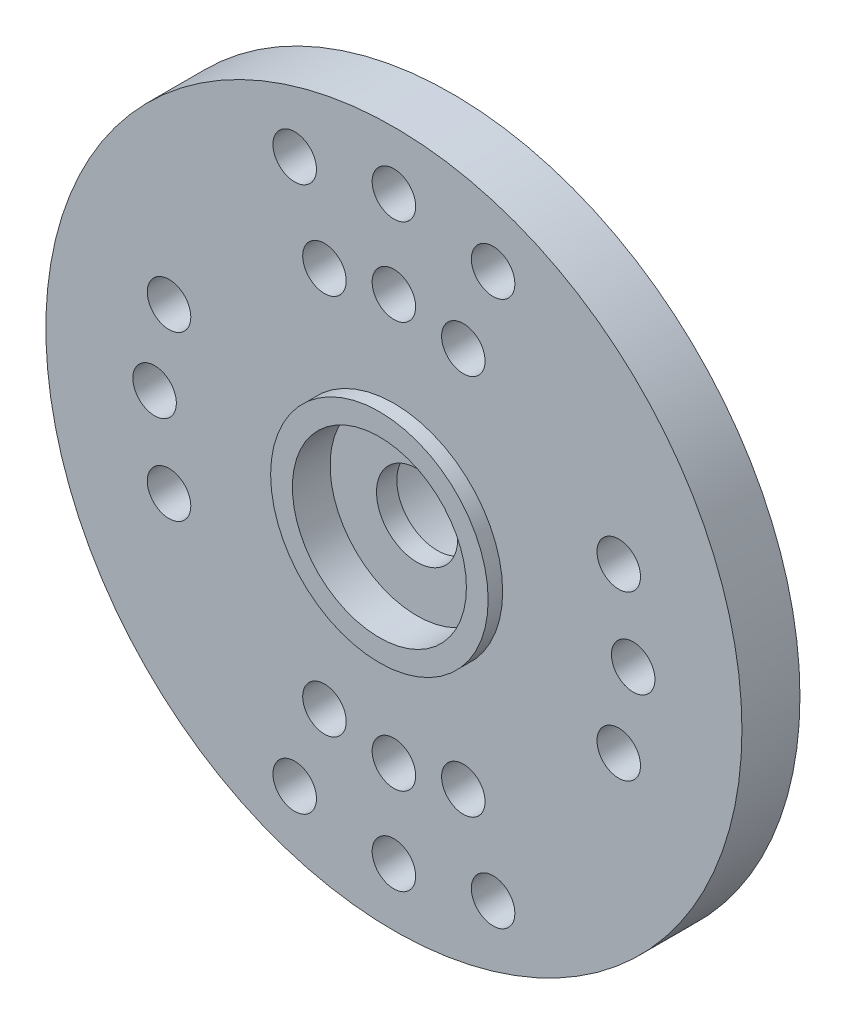
ISO-10303-21;
HEADER;
FILE_DESCRIPTION(('STEP AP214'),'2;1');
FILE_NAME('part.step','',(''),(''),'','','');
FILE_SCHEMA(('AUTOMOTIVE_DESIGN { 1 0 10303 214 1 1 1 1 }'));
ENDSEC;
DATA;
#1=APPLICATION_CONTEXT('core data for automotive mechanical design processes');
#2=APPLICATION_PROTOCOL_DEFINITION('international standard','automotive_design',2000,#1);
#3=PRODUCT_CONTEXT('',#1,'mechanical');
#4=PRODUCT('Part','Part','',(#3));
#5=PRODUCT_RELATED_PRODUCT_CATEGORY('part','',(#4));
#6=PRODUCT_DEFINITION_FORMATION('','',#4);
#7=PRODUCT_DEFINITION_CONTEXT('part definition',#1,'design');
#8=PRODUCT_DEFINITION('design','',#6,#7);
#9=PRODUCT_DEFINITION_SHAPE('','',#8);
#10=(LENGTH_UNIT() NAMED_UNIT(*) SI_UNIT(.MILLI.,.METRE.));
#11=(NAMED_UNIT(*) PLANE_ANGLE_UNIT() SI_UNIT($,.RADIAN.));
#12=(NAMED_UNIT(*) SI_UNIT($,.STERADIAN.) SOLID_ANGLE_UNIT());
#13=UNCERTAINTY_MEASURE_WITH_UNIT(LENGTH_MEASURE(1.E-05),#10,'distance_accuracy_value','');
#14=(GEOMETRIC_REPRESENTATION_CONTEXT(3) GLOBAL_UNCERTAINTY_ASSIGNED_CONTEXT((#13)) GLOBAL_UNIT_ASSIGNED_CONTEXT((#10,
#11,#12)) REPRESENTATION_CONTEXT('',''));
#15=CARTESIAN_POINT('',(0.,0.,0.));
#16=DIRECTION('',(0.,0.,1.));
#17=DIRECTION('',(1.,0.,0.));
#18=AXIS2_PLACEMENT_3D('',#15,#16,#17);
#19=CARTESIAN_POINT('',(0.,3.,-1.5));
#20=DIRECTION('',(0.,0.,-1.));
#21=DIRECTION('',(-1.,0.,0.));
#22=AXIS2_PLACEMENT_3D('',#19,#20,#21);
#23=PLANE('',#22);
#24=CARTESIAN_POINT('',(0.,0.,-1.5));
#25=DIRECTION('',(0.,0.,1.));
#26=DIRECTION('',(1.,0.,0.));
#27=AXIS2_PLACEMENT_3D('',#24,#25,#26);
#28=CIRCLE('',#27,3.);
#29=CARTESIAN_POINT('',(3.,0.,-1.5));
#30=VERTEX_POINT('',#29);
#31=EDGE_CURVE('E17',#30,#30,#28,.F.);
#32=ORIENTED_EDGE('',*,*,#31,.T.);
#33=EDGE_LOOP('',(#32));
#34=FACE_BOUND('',#33,.T.);
#35=CARTESIAN_POINT('',(0.,0.,-1.5));
#36=DIRECTION('',(0.,0.,1.));
#37=DIRECTION('',(1.,0.,0.));
#38=AXIS2_PLACEMENT_3D('',#35,#36,#37);
#39=CIRCLE('',#38,1.4);
#40=CARTESIAN_POINT('',(1.4,0.,-1.5));
#41=VERTEX_POINT('',#40);
#42=EDGE_CURVE('E159',#41,#41,#39,.T.);
#43=ORIENTED_EDGE('',*,*,#42,.T.);
#44=EDGE_LOOP('',(#43));
#45=FACE_BOUND('',#44,.T.);
#46=ADVANCED_FACE('F14',(#34,#45),#23,.T.);
#47=CARTESIAN_POINT('',(0.,0.,50.));
#48=DIRECTION('',(0.,0.,1.));
#49=DIRECTION('',(1.,0.,0.));
#50=AXIS2_PLACEMENT_3D('',#47,#48,#49);
#51=CYLINDRICAL_SURFACE('',#50,3.);
#52=ORIENTED_EDGE('',*,*,#31,.F.);
#53=EDGE_LOOP('',(#52));
#54=FACE_BOUND('',#53,.T.);
#55=CARTESIAN_POINT('',(0.,0.,-4.5));
#56=DIRECTION('',(0.,0.,1.));
#57=DIRECTION('',(1.,0.,0.));
#58=AXIS2_PLACEMENT_3D('',#55,#56,#57);
#59=CIRCLE('',#58,3.);
#60=CARTESIAN_POINT('',(3.,0.,-4.5));
#61=VERTEX_POINT('',#60);
#62=EDGE_CURVE('E157',#61,#61,#59,.T.);
#63=ORIENTED_EDGE('',*,*,#62,.F.);
#64=EDGE_LOOP('',(#63));
#65=FACE_BOUND('',#64,.T.);
#66=ADVANCED_FACE('F167',(#54,#65),#51,.F.);
#67=CARTESIAN_POINT('',(0.,0.,50.));
#68=DIRECTION('',(0.,0.,1.));
#69=DIRECTION('',(1.,0.,0.));
#70=AXIS2_PLACEMENT_3D('',#67,#68,#69);
#71=CYLINDRICAL_SURFACE('',#70,1.4);
#72=ORIENTED_EDGE('',*,*,#42,.F.);
#73=EDGE_LOOP('',(#72));
#74=FACE_BOUND('',#73,.T.);
#75=CARTESIAN_POINT('',(0.,0.,-0.800000000000002));
#76=DIRECTION('',(0.,0.,1.));
#77=DIRECTION('',(1.,0.,0.));
#78=AXIS2_PLACEMENT_3D('',#75,#76,#77);
#79=CIRCLE('',#78,1.4);
#80=CARTESIAN_POINT('',(1.4,0.,-0.800000000000002));
#81=VERTEX_POINT('',#80);
#82=EDGE_CURVE('E154',#81,#81,#79,.T.);
#83=ORIENTED_EDGE('',*,*,#82,.T.);
#84=EDGE_LOOP('',(#83));
#85=FACE_BOUND('',#84,.T.);
#86=ADVANCED_FACE('F170',(#74,#85),#71,.F.);
#87=CARTESIAN_POINT('',(0.,4.5,-4.5));
#88=DIRECTION('',(0.,0.,-1.));
#89=DIRECTION('',(-1.,0.,0.));
#90=AXIS2_PLACEMENT_3D('',#87,#88,#89);
#91=PLANE('',#90);
#92=CARTESIAN_POINT('',(0.,0.,-4.5));
#93=DIRECTION('',(0.,0.,1.));
#94=DIRECTION('',(1.,0.,0.));
#95=AXIS2_PLACEMENT_3D('',#92,#93,#94);
#96=CIRCLE('',#95,4.5);
#97=CARTESIAN_POINT('',(4.5,0.,-4.5));
#98=VERTEX_POINT('',#97);
#99=EDGE_CURVE('E151',#98,#98,#96,.T.);
#100=ORIENTED_EDGE('',*,*,#99,.F.);
#101=EDGE_LOOP('',(#100));
#102=FACE_BOUND('',#101,.T.);
#103=ORIENTED_EDGE('',*,*,#62,.T.);
#104=EDGE_LOOP('',(#103));
#105=FACE_BOUND('',#104,.T.);
#106=ADVANCED_FACE('F173',(#102,#105),#91,.T.);
#107=CARTESIAN_POINT('',(0.,3.,-0.8));
#108=DIRECTION('',(0.,0.,-1.));
#109=DIRECTION('',(-1.,0.,0.));
#110=AXIS2_PLACEMENT_3D('',#107,#108,#109);
#111=PLANE('',#110);
#112=CARTESIAN_POINT('',(0.,0.,-0.800000000000002));
#113=DIRECTION('',(0.,0.,1.));
#114=DIRECTION('',(1.,0.,0.));
#115=AXIS2_PLACEMENT_3D('',#112,#113,#114);
#116=CIRCLE('',#115,3.);
#117=CARTESIAN_POINT('',(3.,0.,-0.800000000000002));
#118=VERTEX_POINT('',#117);
#119=EDGE_CURVE('E148',#118,#118,#116,.T.);
#120=ORIENTED_EDGE('',*,*,#119,.T.);
#121=EDGE_LOOP('',(#120));
#122=FACE_BOUND('',#121,.T.);
#123=ORIENTED_EDGE('',*,*,#82,.F.);
#124=EDGE_LOOP('',(#123));
#125=FACE_BOUND('',#124,.T.);
#126=ADVANCED_FACE('F175',(#122,#125),#111,.F.);
#127=CARTESIAN_POINT('',(0.,0.,50.));
#128=DIRECTION('',(0.,0.,1.));
#129=DIRECTION('',(1.,0.,0.));
#130=AXIS2_PLACEMENT_3D('',#127,#128,#129);
#131=CYLINDRICAL_SURFACE('',#130,4.5);
#132=ORIENTED_EDGE('',*,*,#99,.T.);
#133=EDGE_LOOP('',(#132));
#134=FACE_BOUND('',#133,.T.);
#135=CARTESIAN_POINT('',(0.,0.,-2.));
#136=DIRECTION('',(0.,0.,1.));
#137=DIRECTION('',(1.,0.,0.));
#138=AXIS2_PLACEMENT_3D('',#135,#136,#137);
#139=CIRCLE('',#138,4.5);
#140=CARTESIAN_POINT('',(4.5,0.,-2.));
#141=VERTEX_POINT('',#140);
#142=EDGE_CURVE('E145',#141,#141,#139,.T.);
#143=ORIENTED_EDGE('',*,*,#142,.F.);
#144=EDGE_LOOP('',(#143));
#145=FACE_BOUND('',#144,.T.);
#146=ADVANCED_FACE('F183',(#134,#145),#131,.T.);
#147=CARTESIAN_POINT('',(0.,0.,50.));
#148=DIRECTION('',(0.,0.,1.));
#149=DIRECTION('',(1.,0.,0.));
#150=AXIS2_PLACEMENT_3D('',#147,#148,#149);
#151=CYLINDRICAL_SURFACE('',#150,3.);
#152=ORIENTED_EDGE('',*,*,#119,.F.);
#153=EDGE_LOOP('',(#152));
#154=FACE_BOUND('',#153,.T.);
#155=CARTESIAN_POINT('',(0.,0.,0.5));
#156=DIRECTION('',(0.,0.,1.));
#157=DIRECTION('',(1.,0.,0.));
#158=AXIS2_PLACEMENT_3D('',#155,#156,#157);
#159=CIRCLE('',#158,3.);
#160=CARTESIAN_POINT('',(3.,0.,0.5));
#161=VERTEX_POINT('',#160);
#162=EDGE_CURVE('E142',#161,#161,#159,.T.);
#163=ORIENTED_EDGE('',*,*,#162,.T.);
#164=EDGE_LOOP('',(#163));
#165=FACE_BOUND('',#164,.T.);
#166=ADVANCED_FACE('F284',(#154,#165),#151,.F.);
#167=CARTESIAN_POINT('',(0.,12.,-2.));
#168=DIRECTION('',(0.,0.,-1.));
#169=DIRECTION('',(-1.,0.,0.));
#170=AXIS2_PLACEMENT_3D('',#167,#168,#169);
#171=PLANE('',#170);
#172=CARTESIAN_POINT('',(0.,0.,-2.));
#173=DIRECTION('',(0.,0.,1.));
#174=DIRECTION('',(1.,0.,0.));
#175=AXIS2_PLACEMENT_3D('',#172,#173,#174);
#176=CIRCLE('',#175,12.);
#177=CARTESIAN_POINT('',(12.,0.,-2.));
#178=VERTEX_POINT('',#177);
#179=EDGE_CURVE('E85',#178,#178,#176,.T.);
#180=ORIENTED_EDGE('',*,*,#179,.F.);
#181=EDGE_LOOP('',(#180));
#182=FACE_BOUND('',#181,.T.);
#183=ORIENTED_EDGE('',*,*,#142,.T.);
#184=EDGE_LOOP('',(#183));
#185=FACE_BOUND('',#184,.T.);
#186=CARTESIAN_POINT('',(8.25,0.,-2.));
#187=DIRECTION('',(0.,0.,1.));
#188=DIRECTION('',(1.,0.,0.));
#189=AXIS2_PLACEMENT_3D('',#186,#187,#188);
#190=CIRCLE('',#189,0.750000000000001);
#191=CARTESIAN_POINT('',(9.,0.,-2.));
#192=VERTEX_POINT('',#191);
#193=EDGE_CURVE('E88',#192,#192,#190,.T.);
#194=ORIENTED_EDGE('',*,*,#193,.T.);
#195=EDGE_LOOP('',(#194));
#196=FACE_BOUND('',#195,.T.);
#197=CARTESIAN_POINT('',(7.75246412148374,-2.82166618243677,-2.));
#198=DIRECTION('',(0.,0.,1.));
#199=DIRECTION('',(1.,0.,0.));
#200=AXIS2_PLACEMENT_3D('',#197,#198,#199);
#201=CIRCLE('',#200,0.750000000000001);
#202=CARTESIAN_POINT('',(8.50246412148374,-2.82166618243677,-2.));
#203=VERTEX_POINT('',#202);
#204=EDGE_CURVE('E91',#203,#203,#201,.T.);
#205=ORIENTED_EDGE('',*,*,#204,.T.);
#206=EDGE_LOOP('',(#205));
#207=FACE_BOUND('',#206,.T.);
#208=CARTESIAN_POINT('',(0.,7.,-2.));
#209=DIRECTION('',(0.,0.,1.));
#210=DIRECTION('',(1.,0.,0.));
#211=AXIS2_PLACEMENT_3D('',#208,#209,#210);
#212=CIRCLE('',#211,0.75);
#213=CARTESIAN_POINT('',(0.75,7.,-2.));
#214=VERTEX_POINT('',#213);
#215=EDGE_CURVE('E94',#214,#214,#212,.T.);
#216=ORIENTED_EDGE('',*,*,#215,.T.);
#217=EDGE_LOOP('',(#216));
#218=FACE_BOUND('',#217,.T.);
#219=CARTESIAN_POINT('',(7.75246412148374,2.82166618243677,-2.));
#220=DIRECTION('',(0.,0.,1.));
#221=DIRECTION('',(1.,0.,0.));
#222=AXIS2_PLACEMENT_3D('',#219,#220,#221);
#223=CIRCLE('',#222,0.750000000000001);
#224=CARTESIAN_POINT('',(8.50246412148374,2.82166618243677,-2.));
#225=VERTEX_POINT('',#224);
#226=EDGE_CURVE('E97',#225,#225,#223,.T.);
#227=ORIENTED_EDGE('',*,*,#226,.T.);
#228=EDGE_LOOP('',(#227));
#229=FACE_BOUND('',#228,.T.);
#230=CARTESIAN_POINT('',(-8.25,0.,-2.));
#231=DIRECTION('',(0.,0.,1.));
#232=DIRECTION('',(1.,0.,0.));
#233=AXIS2_PLACEMENT_3D('',#230,#231,#232);
#234=CIRCLE('',#233,0.750000000000001);
#235=CARTESIAN_POINT('',(-7.5,0.,-2.));
#236=VERTEX_POINT('',#235);
#237=EDGE_CURVE('E100',#236,#236,#234,.T.);
#238=ORIENTED_EDGE('',*,*,#237,.T.);
#239=EDGE_LOOP('',(#238));
#240=FACE_BOUND('',#239,.T.);
#241=CARTESIAN_POINT('',(-7.75246412148372,2.82166618243683,-2.));
#242=DIRECTION('',(0.,0.,1.));
#243=DIRECTION('',(1.,0.,0.));
#244=AXIS2_PLACEMENT_3D('',#241,#242,#243);
#245=CIRCLE('',#244,0.75);
#246=CARTESIAN_POINT('',(-7.00246412148372,2.82166618243683,-2.));
#247=VERTEX_POINT('',#246);
#248=EDGE_CURVE('E103',#247,#247,#245,.T.);
#249=ORIENTED_EDGE('',*,*,#248,.T.);
#250=EDGE_LOOP('',(#249));
#251=FACE_BOUND('',#250,.T.);
#252=CARTESIAN_POINT('',(-7.75246412148376,-2.82166618243672,-2.));
#253=DIRECTION('',(0.,0.,1.));
#254=DIRECTION('',(1.,0.,0.));
#255=AXIS2_PLACEMENT_3D('',#252,#253,#254);
#256=CIRCLE('',#255,0.75);
#257=CARTESIAN_POINT('',(-7.00246412148376,-2.82166618243672,-2.));
#258=VERTEX_POINT('',#257);
#259=EDGE_CURVE('E106',#258,#258,#256,.T.);
#260=ORIENTED_EDGE('',*,*,#259,.T.);
#261=EDGE_LOOP('',(#260));
#262=FACE_BOUND('',#261,.T.);
#263=CARTESIAN_POINT('',(0.,10.,-2.));
#264=DIRECTION('',(0.,0.,1.));
#265=DIRECTION('',(1.,0.,0.));
#266=AXIS2_PLACEMENT_3D('',#263,#264,#265);
#267=CIRCLE('',#266,0.75);
#268=CARTESIAN_POINT('',(0.75,10.,-2.));
#269=VERTEX_POINT('',#268);
#270=EDGE_CURVE('E109',#269,#269,#267,.T.);
#271=ORIENTED_EDGE('',*,*,#270,.T.);
#272=EDGE_LOOP('',(#271));
#273=FACE_BOUND('',#272,.T.);
#274=CARTESIAN_POINT('',(2.39414100327969,6.57784834550136,-2.));
#275=DIRECTION('',(0.,0.,1.));
#276=DIRECTION('',(1.,0.,0.));
#277=AXIS2_PLACEMENT_3D('',#274,#275,#276);
#278=CIRCLE('',#277,0.75);
#279=CARTESIAN_POINT('',(3.14414100327969,6.57784834550136,-2.));
#280=VERTEX_POINT('',#279);
#281=EDGE_CURVE('E112',#280,#280,#278,.T.);
#282=ORIENTED_EDGE('',*,*,#281,.T.);
#283=EDGE_LOOP('',(#282));
#284=FACE_BOUND('',#283,.T.);
#285=CARTESIAN_POINT('',(3.4202014332567,9.39692620785908,-2.));
#286=DIRECTION('',(0.,0.,1.));
#287=DIRECTION('',(1.,0.,0.));
#288=AXIS2_PLACEMENT_3D('',#285,#286,#287);
#289=CIRCLE('',#288,0.75);
#290=CARTESIAN_POINT('',(4.1702014332567,9.39692620785908,-2.));
#291=VERTEX_POINT('',#290);
#292=EDGE_CURVE('E115',#291,#291,#289,.T.);
#293=ORIENTED_EDGE('',*,*,#292,.T.);
#294=EDGE_LOOP('',(#293));
#295=FACE_BOUND('',#294,.T.);
#296=CARTESIAN_POINT('',(-2.39414100327969,6.57784834550136,-2.));
#297=DIRECTION('',(0.,0.,1.));
#298=DIRECTION('',(1.,0.,0.));
#299=AXIS2_PLACEMENT_3D('',#296,#297,#298);
#300=CIRCLE('',#299,0.749999999999999);
#301=CARTESIAN_POINT('',(-1.64414100327969,6.57784834550136,-2.));
#302=VERTEX_POINT('',#301);
#303=EDGE_CURVE('E118',#302,#302,#300,.T.);
#304=ORIENTED_EDGE('',*,*,#303,.T.);
#305=EDGE_LOOP('',(#304));
#306=FACE_BOUND('',#305,.T.);
#307=CARTESIAN_POINT('',(-3.4202014332567,9.39692620785908,-2.));
#308=DIRECTION('',(0.,0.,1.));
#309=DIRECTION('',(1.,0.,0.));
#310=AXIS2_PLACEMENT_3D('',#307,#308,#309);
#311=CIRCLE('',#310,0.750000000000001);
#312=CARTESIAN_POINT('',(-2.67020143325669,9.39692620785908,-2.));
#313=VERTEX_POINT('',#312);
#314=EDGE_CURVE('E121',#313,#313,#311,.T.);
#315=ORIENTED_EDGE('',*,*,#314,.T.);
#316=EDGE_LOOP('',(#315));
#317=FACE_BOUND('',#316,.T.);
#318=CARTESIAN_POINT('',(0.,-7.00000000000041,-2.));
#319=DIRECTION('',(0.,0.,1.));
#320=DIRECTION('',(1.,0.,0.));
#321=AXIS2_PLACEMENT_3D('',#318,#319,#320);
#322=CIRCLE('',#321,0.749999999999878);
#323=CARTESIAN_POINT('',(0.749999999999827,-7.00000000000041,-2.));
#324=VERTEX_POINT('',#323);
#325=EDGE_CURVE('E124',#324,#324,#322,.T.);
#326=ORIENTED_EDGE('',*,*,#325,.T.);
#327=EDGE_LOOP('',(#326));
#328=FACE_BOUND('',#327,.T.);
#329=CARTESIAN_POINT('',(-1.06391624818261E-12,-10.0000000000004,-2.));
#330=DIRECTION('',(0.,0.,1.));
#331=DIRECTION('',(1.,0.,0.));
#332=AXIS2_PLACEMENT_3D('',#329,#330,#331);
#333=CIRCLE('',#332,0.74999999999893);
#334=CARTESIAN_POINT('',(0.749999999997866,-10.0000000000004,-2.));
#335=VERTEX_POINT('',#334);
#336=EDGE_CURVE('E127',#335,#335,#333,.T.);
#337=ORIENTED_EDGE('',*,*,#336,.T.);
#338=EDGE_LOOP('',(#337));
#339=FACE_BOUND('',#338,.T.);
#340=CARTESIAN_POINT('',(-2.39414100327964,-6.57784834550095,-2.));
#341=DIRECTION('',(0.,0.,1.));
#342=DIRECTION('',(1.,0.,0.));
#343=AXIS2_PLACEMENT_3D('',#340,#341,#342);
#344=CIRCLE('',#343,0.750000000000075);
#345=CARTESIAN_POINT('',(-1.64414100327956,-6.57784834550095,-2.));
#346=VERTEX_POINT('',#345);
#347=EDGE_CURVE('E130',#346,#346,#344,.T.);
#348=ORIENTED_EDGE('',*,*,#347,.T.);
#349=EDGE_LOOP('',(#348));
#350=FACE_BOUND('',#349,.T.);
#351=CARTESIAN_POINT('',(-3.42020143325761,-9.39692620785832,-2.));
#352=DIRECTION('',(0.,0.,1.));
#353=DIRECTION('',(1.,0.,0.));
#354=AXIS2_PLACEMENT_3D('',#351,#352,#353);
#355=CIRCLE('',#354,0.749999999999109);
#356=CARTESIAN_POINT('',(-2.6702014332585,-9.39692620785832,-2.));
#357=VERTEX_POINT('',#356);
#358=EDGE_CURVE('E133',#357,#357,#355,.T.);
#359=ORIENTED_EDGE('',*,*,#358,.T.);
#360=EDGE_LOOP('',(#359));
#361=FACE_BOUND('',#360,.T.);
#362=CARTESIAN_POINT('',(2.39414100327971,-6.5778483455026,-2.));
#363=DIRECTION('',(0.,0.,1.));
#364=DIRECTION('',(1.,0.,0.));
#365=AXIS2_PLACEMENT_3D('',#362,#363,#364);
#366=CIRCLE('',#365,0.749999999999315);
#367=CARTESIAN_POINT('',(3.14414100327902,-6.5778483455026,-2.));
#368=VERTEX_POINT('',#367);
#369=EDGE_CURVE('E136',#368,#368,#366,.T.);
#370=ORIENTED_EDGE('',*,*,#369,.T.);
#371=EDGE_LOOP('',(#370));
#372=FACE_BOUND('',#371,.T.);
#373=CARTESIAN_POINT('',(3.42020143325573,-9.39692620786069,-2.));
#374=DIRECTION('',(0.,0.,1.));
#375=DIRECTION('',(1.,0.,0.));
#376=AXIS2_PLACEMENT_3D('',#373,#374,#375);
#377=CIRCLE('',#376,0.749999999998336);
#378=CARTESIAN_POINT('',(4.17020143325407,-9.39692620786069,-2.));
#379=VERTEX_POINT('',#378);
#380=EDGE_CURVE('E139',#379,#379,#377,.T.);
#381=ORIENTED_EDGE('',*,*,#380,.T.);
#382=EDGE_LOOP('',(#381));
#383=FACE_BOUND('',#382,.T.);
#384=ADVANCED_FACE('F280',(#182,#185,#196,#207,#218,#229,#240,#251,#262,#273,#284,#295,#306,
#317,#328,#339,#350,#361,#372,#383),#171,.T.);
#385=CARTESIAN_POINT('',(0.,3.75,0.5));
#386=DIRECTION('',(0.,0.,-1.));
#387=DIRECTION('',(-1.,0.,0.));
#388=AXIS2_PLACEMENT_3D('',#385,#386,#387);
#389=PLANE('',#388);
#390=CARTESIAN_POINT('',(0.,0.,0.5));
#391=DIRECTION('',(0.,0.,1.));
#392=DIRECTION('',(1.,0.,0.));
#393=AXIS2_PLACEMENT_3D('',#390,#391,#392);
#394=CIRCLE('',#393,3.75);
#395=CARTESIAN_POINT('',(3.75,0.,0.5));
#396=VERTEX_POINT('',#395);
#397=EDGE_CURVE('E82',#396,#396,#394,.F.);
#398=ORIENTED_EDGE('',*,*,#397,.F.);
#399=EDGE_LOOP('',(#398));
#400=FACE_BOUND('',#399,.T.);
#401=ORIENTED_EDGE('',*,*,#162,.F.);
#402=EDGE_LOOP('',(#401));
#403=FACE_BOUND('',#402,.T.);
#404=ADVANCED_FACE('F276',(#400,#403),#389,.F.);
#405=CARTESIAN_POINT('',(3.42020143325573,-9.39692620786069,-4.5));
#406=DIRECTION('',(0.,0.,1.));
#407=DIRECTION('',(1.,0.,0.));
#408=AXIS2_PLACEMENT_3D('',#405,#406,#407);
#409=CYLINDRICAL_SURFACE('',#408,0.749999999998336);
#410=CARTESIAN_POINT('',(3.42020143325573,-9.39692620786069,0.));
#411=DIRECTION('',(0.,0.,1.));
#412=DIRECTION('',(1.,0.,0.));
#413=AXIS2_PLACEMENT_3D('',#410,#411,#412);
#414=CIRCLE('',#413,0.749999999998336);
#415=CARTESIAN_POINT('',(4.17020143325407,-9.39692620786069,0.));
#416=VERTEX_POINT('',#415);
#417=EDGE_CURVE('E79',#416,#416,#414,.F.);
#418=ORIENTED_EDGE('',*,*,#417,.F.);
#419=EDGE_LOOP('',(#418));
#420=FACE_BOUND('',#419,.T.);
#421=ORIENTED_EDGE('',*,*,#380,.F.);
#422=EDGE_LOOP('',(#421));
#423=FACE_BOUND('',#422,.T.);
#424=ADVANCED_FACE('F272',(#420,#423),#409,.F.);
#425=CARTESIAN_POINT('',(2.39414100327971,-6.5778483455026,-4.5));
#426=DIRECTION('',(0.,0.,1.));
#427=DIRECTION('',(1.,0.,0.));
#428=AXIS2_PLACEMENT_3D('',#425,#426,#427);
#429=CYLINDRICAL_SURFACE('',#428,0.749999999999315);
#430=CARTESIAN_POINT('',(2.39414100327971,-6.5778483455026,0.));
#431=DIRECTION('',(0.,0.,1.));
#432=DIRECTION('',(1.,0.,0.));
#433=AXIS2_PLACEMENT_3D('',#430,#431,#432);
#434=CIRCLE('',#433,0.749999999999315);
#435=CARTESIAN_POINT('',(3.14414100327902,-6.5778483455026,0.));
#436=VERTEX_POINT('',#435);
#437=EDGE_CURVE('E76',#436,#436,#434,.F.);
#438=ORIENTED_EDGE('',*,*,#437,.F.);
#439=EDGE_LOOP('',(#438));
#440=FACE_BOUND('',#439,.T.);
#441=ORIENTED_EDGE('',*,*,#369,.F.);
#442=EDGE_LOOP('',(#441));
#443=FACE_BOUND('',#442,.T.);
#444=ADVANCED_FACE('F268',(#440,#443),#429,.F.);
#445=CARTESIAN_POINT('',(-3.42020143325761,-9.39692620785832,-4.5));
#446=DIRECTION('',(0.,0.,1.));
#447=DIRECTION('',(1.,0.,0.));
#448=AXIS2_PLACEMENT_3D('',#445,#446,#447);
#449=CYLINDRICAL_SURFACE('',#448,0.749999999999109);
#450=CARTESIAN_POINT('',(-3.42020143325761,-9.39692620785832,0.));
#451=DIRECTION('',(0.,0.,1.));
#452=DIRECTION('',(1.,0.,0.));
#453=AXIS2_PLACEMENT_3D('',#450,#451,#452);
#454=CIRCLE('',#453,0.749999999999109);
#455=CARTESIAN_POINT('',(-2.6702014332585,-9.39692620785832,0.));
#456=VERTEX_POINT('',#455);
#457=EDGE_CURVE('E73',#456,#456,#454,.F.);
#458=ORIENTED_EDGE('',*,*,#457,.F.);
#459=EDGE_LOOP('',(#458));
#460=FACE_BOUND('',#459,.T.);
#461=ORIENTED_EDGE('',*,*,#358,.F.);
#462=EDGE_LOOP('',(#461));
#463=FACE_BOUND('',#462,.T.);
#464=ADVANCED_FACE('F264',(#460,#463),#449,.F.);
#465=CARTESIAN_POINT('',(-2.39414100327964,-6.57784834550095,-4.5));
#466=DIRECTION('',(0.,0.,1.));
#467=DIRECTION('',(1.,0.,0.));
#468=AXIS2_PLACEMENT_3D('',#465,#466,#467);
#469=CYLINDRICAL_SURFACE('',#468,0.750000000000075);
#470=CARTESIAN_POINT('',(-2.39414100327964,-6.57784834550095,0.));
#471=DIRECTION('',(0.,0.,1.));
#472=DIRECTION('',(1.,0.,0.));
#473=AXIS2_PLACEMENT_3D('',#470,#471,#472);
#474=CIRCLE('',#473,0.750000000000075);
#475=CARTESIAN_POINT('',(-1.64414100327956,-6.57784834550095,0.));
#476=VERTEX_POINT('',#475);
#477=EDGE_CURVE('E70',#476,#476,#474,.F.);
#478=ORIENTED_EDGE('',*,*,#477,.F.);
#479=EDGE_LOOP('',(#478));
#480=FACE_BOUND('',#479,.T.);
#481=ORIENTED_EDGE('',*,*,#347,.F.);
#482=EDGE_LOOP('',(#481));
#483=FACE_BOUND('',#482,.T.);
#484=ADVANCED_FACE('F260',(#480,#483),#469,.F.);
#485=CARTESIAN_POINT('',(-1.06391624818261E-12,-10.0000000000004,-4.5));
#486=DIRECTION('',(0.,0.,1.));
#487=DIRECTION('',(1.,0.,0.));
#488=AXIS2_PLACEMENT_3D('',#485,#486,#487);
#489=CYLINDRICAL_SURFACE('',#488,0.74999999999893);
#490=CARTESIAN_POINT('',(-1.06391624818261E-12,-10.0000000000004,0.));
#491=DIRECTION('',(0.,0.,1.));
#492=DIRECTION('',(1.,0.,0.));
#493=AXIS2_PLACEMENT_3D('',#490,#491,#492);
#494=CIRCLE('',#493,0.74999999999893);
#495=CARTESIAN_POINT('',(0.749999999997866,-10.0000000000004,0.));
#496=VERTEX_POINT('',#495);
#497=EDGE_CURVE('E67',#496,#496,#494,.F.);
#498=ORIENTED_EDGE('',*,*,#497,.F.);
#499=EDGE_LOOP('',(#498));
#500=FACE_BOUND('',#499,.T.);
#501=ORIENTED_EDGE('',*,*,#336,.F.);
#502=EDGE_LOOP('',(#501));
#503=FACE_BOUND('',#502,.T.);
#504=ADVANCED_FACE('F256',(#500,#503),#489,.F.);
#505=CARTESIAN_POINT('',(0.,-7.00000000000041,-4.5));
#506=DIRECTION('',(0.,0.,1.));
#507=DIRECTION('',(1.,0.,0.));
#508=AXIS2_PLACEMENT_3D('',#505,#506,#507);
#509=CYLINDRICAL_SURFACE('',#508,0.749999999999878);
#510=CARTESIAN_POINT('',(0.,-7.00000000000041,0.));
#511=DIRECTION('',(0.,0.,1.));
#512=DIRECTION('',(1.,0.,0.));
#513=AXIS2_PLACEMENT_3D('',#510,#511,#512);
#514=CIRCLE('',#513,0.749999999999878);
#515=CARTESIAN_POINT('',(0.749999999999827,-7.00000000000041,0.));
#516=VERTEX_POINT('',#515);
#517=EDGE_CURVE('E64',#516,#516,#514,.F.);
#518=ORIENTED_EDGE('',*,*,#517,.F.);
#519=EDGE_LOOP('',(#518));
#520=FACE_BOUND('',#519,.T.);
#521=ORIENTED_EDGE('',*,*,#325,.F.);
#522=EDGE_LOOP('',(#521));
#523=FACE_BOUND('',#522,.T.);
#524=ADVANCED_FACE('F252',(#520,#523),#509,.F.);
#525=CARTESIAN_POINT('',(-3.4202014332567,9.39692620785908,-4.5));
#526=DIRECTION('',(0.,0.,1.));
#527=DIRECTION('',(1.,0.,0.));
#528=AXIS2_PLACEMENT_3D('',#525,#526,#527);
#529=CYLINDRICAL_SURFACE('',#528,0.750000000000001);
#530=CARTESIAN_POINT('',(-3.4202014332567,9.39692620785908,0.));
#531=DIRECTION('',(0.,0.,1.));
#532=DIRECTION('',(1.,0.,0.));
#533=AXIS2_PLACEMENT_3D('',#530,#531,#532);
#534=CIRCLE('',#533,0.750000000000001);
#535=CARTESIAN_POINT('',(-2.67020143325669,9.39692620785908,0.));
#536=VERTEX_POINT('',#535);
#537=EDGE_CURVE('E61',#536,#536,#534,.F.);
#538=ORIENTED_EDGE('',*,*,#537,.F.);
#539=EDGE_LOOP('',(#538));
#540=FACE_BOUND('',#539,.T.);
#541=ORIENTED_EDGE('',*,*,#314,.F.);
#542=EDGE_LOOP('',(#541));
#543=FACE_BOUND('',#542,.T.);
#544=ADVANCED_FACE('F248',(#540,#543),#529,.F.);
#545=CARTESIAN_POINT('',(-2.39414100327969,6.57784834550136,-4.5));
#546=DIRECTION('',(0.,0.,1.));
#547=DIRECTION('',(1.,0.,0.));
#548=AXIS2_PLACEMENT_3D('',#545,#546,#547);
#549=CYLINDRICAL_SURFACE('',#548,0.749999999999999);
#550=CARTESIAN_POINT('',(-2.39414100327969,6.57784834550136,0.));
#551=DIRECTION('',(0.,0.,1.));
#552=DIRECTION('',(1.,0.,0.));
#553=AXIS2_PLACEMENT_3D('',#550,#551,#552);
#554=CIRCLE('',#553,0.749999999999999);
#555=CARTESIAN_POINT('',(-1.64414100327969,6.57784834550136,0.));
#556=VERTEX_POINT('',#555);
#557=EDGE_CURVE('E58',#556,#556,#554,.F.);
#558=ORIENTED_EDGE('',*,*,#557,.F.);
#559=EDGE_LOOP('',(#558));
#560=FACE_BOUND('',#559,.T.);
#561=ORIENTED_EDGE('',*,*,#303,.F.);
#562=EDGE_LOOP('',(#561));
#563=FACE_BOUND('',#562,.T.);
#564=ADVANCED_FACE('F244',(#560,#563),#549,.F.);
#565=CARTESIAN_POINT('',(3.4202014332567,9.39692620785908,-4.5));
#566=DIRECTION('',(0.,0.,1.));
#567=DIRECTION('',(1.,0.,0.));
#568=AXIS2_PLACEMENT_3D('',#565,#566,#567);
#569=CYLINDRICAL_SURFACE('',#568,0.75);
#570=CARTESIAN_POINT('',(3.4202014332567,9.39692620785908,0.));
#571=DIRECTION('',(0.,0.,1.));
#572=DIRECTION('',(1.,0.,0.));
#573=AXIS2_PLACEMENT_3D('',#570,#571,#572);
#574=CIRCLE('',#573,0.75);
#575=CARTESIAN_POINT('',(4.1702014332567,9.39692620785908,0.));
#576=VERTEX_POINT('',#575);
#577=EDGE_CURVE('E55',#576,#576,#574,.F.);
#578=ORIENTED_EDGE('',*,*,#577,.F.);
#579=EDGE_LOOP('',(#578));
#580=FACE_BOUND('',#579,.T.);
#581=ORIENTED_EDGE('',*,*,#292,.F.);
#582=EDGE_LOOP('',(#581));
#583=FACE_BOUND('',#582,.T.);
#584=ADVANCED_FACE('F240',(#580,#583),#569,.F.);
#585=CARTESIAN_POINT('',(2.39414100327969,6.57784834550136,-4.5));
#586=DIRECTION('',(0.,0.,1.));
#587=DIRECTION('',(1.,0.,0.));
#588=AXIS2_PLACEMENT_3D('',#585,#586,#587);
#589=CYLINDRICAL_SURFACE('',#588,0.75);
#590=CARTESIAN_POINT('',(2.39414100327969,6.57784834550136,0.));
#591=DIRECTION('',(0.,0.,1.));
#592=DIRECTION('',(1.,0.,0.));
#593=AXIS2_PLACEMENT_3D('',#590,#591,#592);
#594=CIRCLE('',#593,0.75);
#595=CARTESIAN_POINT('',(3.14414100327969,6.57784834550136,0.));
#596=VERTEX_POINT('',#595);
#597=EDGE_CURVE('E52',#596,#596,#594,.F.);
#598=ORIENTED_EDGE('',*,*,#597,.F.);
#599=EDGE_LOOP('',(#598));
#600=FACE_BOUND('',#599,.T.);
#601=ORIENTED_EDGE('',*,*,#281,.F.);
#602=EDGE_LOOP('',(#601));
#603=FACE_BOUND('',#602,.T.);
#604=ADVANCED_FACE('F236',(#600,#603),#589,.F.);
#605=CARTESIAN_POINT('',(0.,10.,-4.5));
#606=DIRECTION('',(0.,0.,1.));
#607=DIRECTION('',(1.,0.,0.));
#608=AXIS2_PLACEMENT_3D('',#605,#606,#607);
#609=CYLINDRICAL_SURFACE('',#608,0.75);
#610=CARTESIAN_POINT('',(0.,10.,0.));
#611=DIRECTION('',(0.,0.,1.));
#612=DIRECTION('',(1.,0.,0.));
#613=AXIS2_PLACEMENT_3D('',#610,#611,#612);
#614=CIRCLE('',#613,0.75);
#615=CARTESIAN_POINT('',(0.75,10.,0.));
#616=VERTEX_POINT('',#615);
#617=EDGE_CURVE('E49',#616,#616,#614,.F.);
#618=ORIENTED_EDGE('',*,*,#617,.F.);
#619=EDGE_LOOP('',(#618));
#620=FACE_BOUND('',#619,.T.);
#621=ORIENTED_EDGE('',*,*,#270,.F.);
#622=EDGE_LOOP('',(#621));
#623=FACE_BOUND('',#622,.T.);
#624=ADVANCED_FACE('F232',(#620,#623),#609,.F.);
#625=CARTESIAN_POINT('',(-7.75246412148376,-2.82166618243672,-4.5));
#626=DIRECTION('',(0.,0.,1.));
#627=DIRECTION('',(1.,0.,0.));
#628=AXIS2_PLACEMENT_3D('',#625,#626,#627);
#629=CYLINDRICAL_SURFACE('',#628,0.75);
#630=CARTESIAN_POINT('',(-7.75246412148376,-2.82166618243672,0.));
#631=DIRECTION('',(0.,0.,1.));
#632=DIRECTION('',(1.,0.,0.));
#633=AXIS2_PLACEMENT_3D('',#630,#631,#632);
#634=CIRCLE('',#633,0.75);
#635=CARTESIAN_POINT('',(-7.00246412148376,-2.82166618243672,0.));
#636=VERTEX_POINT('',#635);
#637=EDGE_CURVE('E46',#636,#636,#634,.F.);
#638=ORIENTED_EDGE('',*,*,#637,.F.);
#639=EDGE_LOOP('',(#638));
#640=FACE_BOUND('',#639,.T.);
#641=ORIENTED_EDGE('',*,*,#259,.F.);
#642=EDGE_LOOP('',(#641));
#643=FACE_BOUND('',#642,.T.);
#644=ADVANCED_FACE('F228',(#640,#643),#629,.F.);
#645=CARTESIAN_POINT('',(-7.75246412148372,2.82166618243683,-4.5));
#646=DIRECTION('',(0.,0.,1.));
#647=DIRECTION('',(1.,0.,0.));
#648=AXIS2_PLACEMENT_3D('',#645,#646,#647);
#649=CYLINDRICAL_SURFACE('',#648,0.75);
#650=CARTESIAN_POINT('',(-7.75246412148372,2.82166618243683,0.));
#651=DIRECTION('',(0.,0.,1.));
#652=DIRECTION('',(1.,0.,0.));
#653=AXIS2_PLACEMENT_3D('',#650,#651,#652);
#654=CIRCLE('',#653,0.75);
#655=CARTESIAN_POINT('',(-7.00246412148372,2.82166618243683,0.));
#656=VERTEX_POINT('',#655);
#657=EDGE_CURVE('E43',#656,#656,#654,.F.);
#658=ORIENTED_EDGE('',*,*,#657,.F.);
#659=EDGE_LOOP('',(#658));
#660=FACE_BOUND('',#659,.T.);
#661=ORIENTED_EDGE('',*,*,#248,.F.);
#662=EDGE_LOOP('',(#661));
#663=FACE_BOUND('',#662,.T.);
#664=ADVANCED_FACE('F224',(#660,#663),#649,.F.);
#665=CARTESIAN_POINT('',(-8.25,0.,-4.5));
#666=DIRECTION('',(0.,0.,1.));
#667=DIRECTION('',(1.,0.,0.));
#668=AXIS2_PLACEMENT_3D('',#665,#666,#667);
#669=CYLINDRICAL_SURFACE('',#668,0.750000000000001);
#670=CARTESIAN_POINT('',(-8.25,0.,0.));
#671=DIRECTION('',(0.,0.,1.));
#672=DIRECTION('',(1.,0.,0.));
#673=AXIS2_PLACEMENT_3D('',#670,#671,#672);
#674=CIRCLE('',#673,0.750000000000001);
#675=CARTESIAN_POINT('',(-7.5,0.,0.));
#676=VERTEX_POINT('',#675);
#677=EDGE_CURVE('E40',#676,#676,#674,.F.);
#678=ORIENTED_EDGE('',*,*,#677,.F.);
#679=EDGE_LOOP('',(#678));
#680=FACE_BOUND('',#679,.T.);
#681=ORIENTED_EDGE('',*,*,#237,.F.);
#682=EDGE_LOOP('',(#681));
#683=FACE_BOUND('',#682,.T.);
#684=ADVANCED_FACE('F220',(#680,#683),#669,.F.);
#685=CARTESIAN_POINT('',(7.75246412148374,2.82166618243677,-4.5));
#686=DIRECTION('',(0.,0.,1.));
#687=DIRECTION('',(1.,0.,0.));
#688=AXIS2_PLACEMENT_3D('',#685,#686,#687);
#689=CYLINDRICAL_SURFACE('',#688,0.750000000000001);
#690=CARTESIAN_POINT('',(7.75246412148374,2.82166618243677,0.));
#691=DIRECTION('',(0.,0.,1.));
#692=DIRECTION('',(1.,0.,0.));
#693=AXIS2_PLACEMENT_3D('',#690,#691,#692);
#694=CIRCLE('',#693,0.750000000000001);
#695=CARTESIAN_POINT('',(8.50246412148374,2.82166618243677,0.));
#696=VERTEX_POINT('',#695);
#697=EDGE_CURVE('E37',#696,#696,#694,.F.);
#698=ORIENTED_EDGE('',*,*,#697,.F.);
#699=EDGE_LOOP('',(#698));
#700=FACE_BOUND('',#699,.T.);
#701=ORIENTED_EDGE('',*,*,#226,.F.);
#702=EDGE_LOOP('',(#701));
#703=FACE_BOUND('',#702,.T.);
#704=ADVANCED_FACE('F216',(#700,#703),#689,.F.);
#705=CARTESIAN_POINT('',(0.,7.,-4.5));
#706=DIRECTION('',(0.,0.,1.));
#707=DIRECTION('',(1.,0.,0.));
#708=AXIS2_PLACEMENT_3D('',#705,#706,#707);
#709=CYLINDRICAL_SURFACE('',#708,0.75);
#710=CARTESIAN_POINT('',(0.,7.,0.));
#711=DIRECTION('',(0.,0.,1.));
#712=DIRECTION('',(1.,0.,0.));
#713=AXIS2_PLACEMENT_3D('',#710,#711,#712);
#714=CIRCLE('',#713,0.75);
#715=CARTESIAN_POINT('',(0.75,7.,0.));
#716=VERTEX_POINT('',#715);
#717=EDGE_CURVE('E34',#716,#716,#714,.F.);
#718=ORIENTED_EDGE('',*,*,#717,.F.);
#719=EDGE_LOOP('',(#718));
#720=FACE_BOUND('',#719,.T.);
#721=ORIENTED_EDGE('',*,*,#215,.F.);
#722=EDGE_LOOP('',(#721));
#723=FACE_BOUND('',#722,.T.);
#724=ADVANCED_FACE('F212',(#720,#723),#709,.F.);
#725=CARTESIAN_POINT('',(7.75246412148374,-2.82166618243677,-4.5));
#726=DIRECTION('',(0.,0.,1.));
#727=DIRECTION('',(1.,0.,0.));
#728=AXIS2_PLACEMENT_3D('',#725,#726,#727);
#729=CYLINDRICAL_SURFACE('',#728,0.750000000000001);
#730=CARTESIAN_POINT('',(7.75246412148374,-2.82166618243677,0.));
#731=DIRECTION('',(0.,0.,1.));
#732=DIRECTION('',(1.,0.,0.));
#733=AXIS2_PLACEMENT_3D('',#730,#731,#732);
#734=CIRCLE('',#733,0.750000000000001);
#735=CARTESIAN_POINT('',(8.50246412148374,-2.82166618243677,0.));
#736=VERTEX_POINT('',#735);
#737=EDGE_CURVE('E31',#736,#736,#734,.F.);
#738=ORIENTED_EDGE('',*,*,#737,.F.);
#739=EDGE_LOOP('',(#738));
#740=FACE_BOUND('',#739,.T.);
#741=ORIENTED_EDGE('',*,*,#204,.F.);
#742=EDGE_LOOP('',(#741));
#743=FACE_BOUND('',#742,.T.);
#744=ADVANCED_FACE('F208',(#740,#743),#729,.F.);
#745=CARTESIAN_POINT('',(8.25,0.,-4.5));
#746=DIRECTION('',(0.,0.,1.));
#747=DIRECTION('',(1.,0.,0.));
#748=AXIS2_PLACEMENT_3D('',#745,#746,#747);
#749=CYLINDRICAL_SURFACE('',#748,0.750000000000001);
#750=CARTESIAN_POINT('',(8.25,0.,0.));
#751=DIRECTION('',(0.,0.,1.));
#752=DIRECTION('',(1.,0.,0.));
#753=AXIS2_PLACEMENT_3D('',#750,#751,#752);
#754=CIRCLE('',#753,0.750000000000001);
#755=CARTESIAN_POINT('',(9.,0.,0.));
#756=VERTEX_POINT('',#755);
#757=EDGE_CURVE('E26',#756,#756,#754,.F.);
#758=ORIENTED_EDGE('',*,*,#757,.F.);
#759=EDGE_LOOP('',(#758));
#760=FACE_BOUND('',#759,.T.);
#761=ORIENTED_EDGE('',*,*,#193,.F.);
#762=EDGE_LOOP('',(#761));
#763=FACE_BOUND('',#762,.T.);
#764=ADVANCED_FACE('F204',(#760,#763),#749,.F.);
#765=CARTESIAN_POINT('',(0.,0.,50.));
#766=DIRECTION('',(0.,0.,1.));
#767=DIRECTION('',(1.,0.,0.));
#768=AXIS2_PLACEMENT_3D('',#765,#766,#767);
#769=CYLINDRICAL_SURFACE('',#768,12.);
#770=ORIENTED_EDGE('',*,*,#179,.T.);
#771=EDGE_LOOP('',(#770));
#772=FACE_BOUND('',#771,.T.);
#773=CARTESIAN_POINT('',(0.,0.,0.));
#774=DIRECTION('',(0.,0.,1.));
#775=DIRECTION('',(1.,0.,0.));
#776=AXIS2_PLACEMENT_3D('',#773,#774,#775);
#777=CIRCLE('',#776,12.);
#778=CARTESIAN_POINT('',(12.,0.,0.));
#779=VERTEX_POINT('',#778);
#780=EDGE_CURVE('E21',#779,#779,#777,.T.);
#781=ORIENTED_EDGE('',*,*,#780,.F.);
#782=EDGE_LOOP('',(#781));
#783=FACE_BOUND('',#782,.T.);
#784=ADVANCED_FACE('F198',(#772,#783),#769,.T.);
#785=CARTESIAN_POINT('',(0.,0.,50.));
#786=DIRECTION('',(0.,0.,1.));
#787=DIRECTION('',(1.,0.,0.));
#788=AXIS2_PLACEMENT_3D('',#785,#786,#787);
#789=CYLINDRICAL_SURFACE('',#788,3.75);
#790=CARTESIAN_POINT('',(0.,0.,0.));
#791=DIRECTION('',(0.,0.,1.));
#792=DIRECTION('',(1.,0.,0.));
#793=AXIS2_PLACEMENT_3D('',#790,#791,#792);
#794=CIRCLE('',#793,3.75);
#795=CARTESIAN_POINT('',(3.75,0.,0.));
#796=VERTEX_POINT('',#795);
#797=EDGE_CURVE('E10',#796,#796,#794,.F.);
#798=ORIENTED_EDGE('',*,*,#797,.F.);
#799=EDGE_LOOP('',(#798));
#800=FACE_BOUND('',#799,.T.);
#801=ORIENTED_EDGE('',*,*,#397,.T.);
#802=EDGE_LOOP('',(#801));
#803=FACE_BOUND('',#802,.T.);
#804=ADVANCED_FACE('F191',(#800,#803),#789,.T.);
#805=CARTESIAN_POINT('',(0.,3.75,0.));
#806=DIRECTION('',(0.,0.,1.));
#807=DIRECTION('',(1.,0.,0.));
#808=AXIS2_PLACEMENT_3D('',#805,#806,#807);
#809=PLANE('',#808);
#810=ORIENTED_EDGE('',*,*,#797,.T.);
#811=EDGE_LOOP('',(#810));
#812=FACE_BOUND('',#811,.T.);
#813=ORIENTED_EDGE('',*,*,#780,.T.);
#814=EDGE_LOOP('',(#813));
#815=FACE_BOUND('',#814,.T.);
#816=ORIENTED_EDGE('',*,*,#757,.T.);
#817=EDGE_LOOP('',(#816));
#818=FACE_BOUND('',#817,.T.);
#819=ORIENTED_EDGE('',*,*,#737,.T.);
#820=EDGE_LOOP('',(#819));
#821=FACE_BOUND('',#820,.T.);
#822=ORIENTED_EDGE('',*,*,#717,.T.);
#823=EDGE_LOOP('',(#822));
#824=FACE_BOUND('',#823,.T.);
#825=ORIENTED_EDGE('',*,*,#697,.T.);
#826=EDGE_LOOP('',(#825));
#827=FACE_BOUND('',#826,.T.);
#828=ORIENTED_EDGE('',*,*,#677,.T.);
#829=EDGE_LOOP('',(#828));
#830=FACE_BOUND('',#829,.T.);
#831=ORIENTED_EDGE('',*,*,#657,.T.);
#832=EDGE_LOOP('',(#831));
#833=FACE_BOUND('',#832,.T.);
#834=ORIENTED_EDGE('',*,*,#637,.T.);
#835=EDGE_LOOP('',(#834));
#836=FACE_BOUND('',#835,.T.);
#837=ORIENTED_EDGE('',*,*,#617,.T.);
#838=EDGE_LOOP('',(#837));
#839=FACE_BOUND('',#838,.T.);
#840=ORIENTED_EDGE('',*,*,#597,.T.);
#841=EDGE_LOOP('',(#840));
#842=FACE_BOUND('',#841,.T.);
#843=ORIENTED_EDGE('',*,*,#577,.T.);
#844=EDGE_LOOP('',(#843));
#845=FACE_BOUND('',#844,.T.);
#846=ORIENTED_EDGE('',*,*,#557,.T.);
#847=EDGE_LOOP('',(#846));
#848=FACE_BOUND('',#847,.T.);
#849=ORIENTED_EDGE('',*,*,#537,.T.);
#850=EDGE_LOOP('',(#849));
#851=FACE_BOUND('',#850,.T.);
#852=ORIENTED_EDGE('',*,*,#517,.T.);
#853=EDGE_LOOP('',(#852));
#854=FACE_BOUND('',#853,.T.);
#855=ORIENTED_EDGE('',*,*,#497,.T.);
#856=EDGE_LOOP('',(#855));
#857=FACE_BOUND('',#856,.T.);
#858=ORIENTED_EDGE('',*,*,#477,.T.);
#859=EDGE_LOOP('',(#858));
#860=FACE_BOUND('',#859,.T.);
#861=ORIENTED_EDGE('',*,*,#457,.T.);
#862=EDGE_LOOP('',(#861));
#863=FACE_BOUND('',#862,.T.);
#864=ORIENTED_EDGE('',*,*,#437,.T.);
#865=EDGE_LOOP('',(#864));
#866=FACE_BOUND('',#865,.T.);
#867=ORIENTED_EDGE('',*,*,#417,.T.);
#868=EDGE_LOOP('',(#867));
#869=FACE_BOUND('',#868,.T.);
#870=ADVANCED_FACE('F189',(#812,#815,#818,#821,#824,#827,#830,#833,#836,#839,#842,#845,#848,
#851,#854,#857,#860,#863,#866,#869),#809,.T.);
#871=CLOSED_SHELL('',(#46,#66,#86,#106,#126,#146,#166,#384,#404,#424,#444,#464,#484,#504,#524,
#544,#564,#584,#604,#624,#644,#664,#684,#704,#724,#744,#764,#784,#804,#870));
#872=MANIFOLD_SOLID_BREP('B1',#871);
#873=ADVANCED_BREP_SHAPE_REPRESENTATION('',(#18,#872),#14);
#874=SHAPE_DEFINITION_REPRESENTATION(#9,#873);
ENDSEC;
END-ISO-10303-21;
